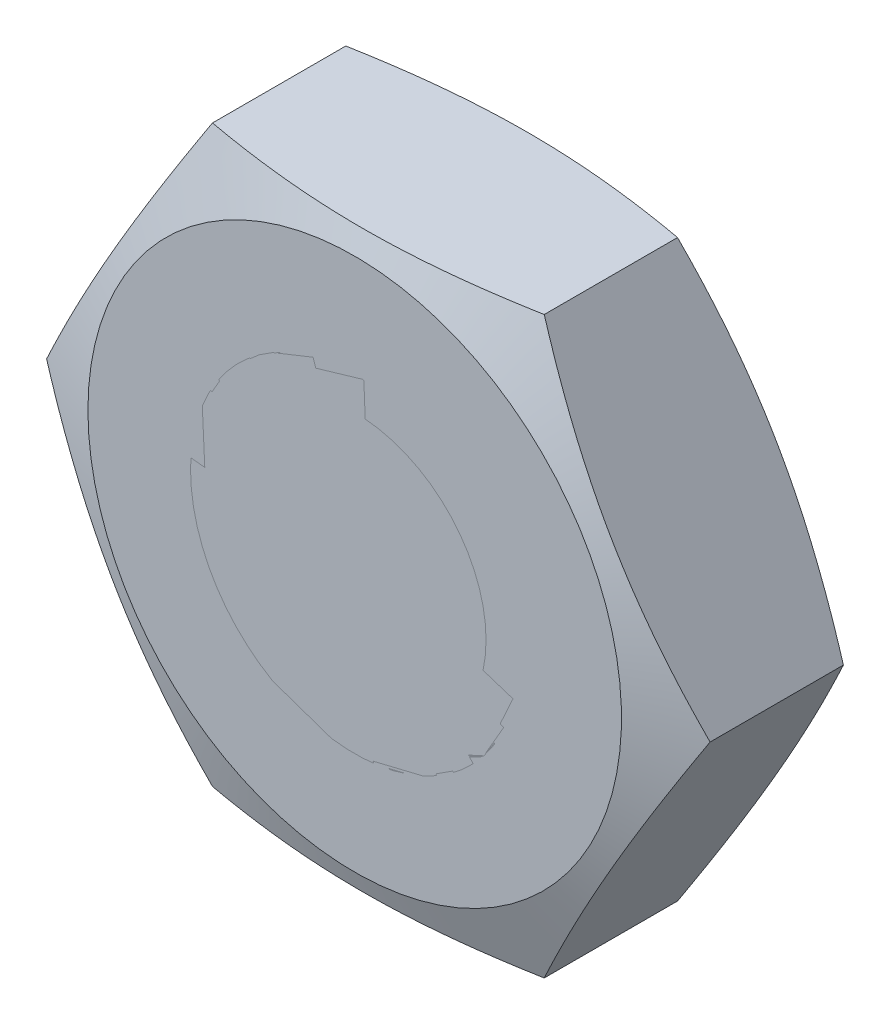
ISO-10303-21;
HEADER;
FILE_DESCRIPTION(('STEP AP214'),'2;1');
FILE_NAME('part.step','',(''),(''),'','','');
FILE_SCHEMA(('AUTOMOTIVE_DESIGN { 1 0 10303 214 1 1 1 1 }'));
ENDSEC;
DATA;
#1=APPLICATION_CONTEXT('core data for automotive mechanical design processes');
#2=APPLICATION_PROTOCOL_DEFINITION('international standard','automotive_design',2000,#1);
#3=PRODUCT_CONTEXT('',#1,'mechanical');
#4=PRODUCT('Part','Part','',(#3));
#5=PRODUCT_RELATED_PRODUCT_CATEGORY('part','',(#4));
#6=PRODUCT_DEFINITION_FORMATION('','',#4);
#7=PRODUCT_DEFINITION_CONTEXT('part definition',#1,'design');
#8=PRODUCT_DEFINITION('design','',#6,#7);
#9=PRODUCT_DEFINITION_SHAPE('','',#8);
#10=(LENGTH_UNIT() NAMED_UNIT(*) SI_UNIT(.MILLI.,.METRE.));
#11=(NAMED_UNIT(*) PLANE_ANGLE_UNIT() SI_UNIT($,.RADIAN.));
#12=(NAMED_UNIT(*) SI_UNIT($,.STERADIAN.) SOLID_ANGLE_UNIT());
#13=UNCERTAINTY_MEASURE_WITH_UNIT(LENGTH_MEASURE(1.E-05),#10,'distance_accuracy_value','');
#14=(GEOMETRIC_REPRESENTATION_CONTEXT(3) GLOBAL_UNCERTAINTY_ASSIGNED_CONTEXT((#13)) GLOBAL_UNIT_ASSIGNED_CONTEXT((#10,
#11,#12)) REPRESENTATION_CONTEXT('',''));
#15=CARTESIAN_POINT('',(0.,0.,0.));
#16=DIRECTION('',(0.,0.,1.));
#17=DIRECTION('',(1.,0.,0.));
#18=AXIS2_PLACEMENT_3D('',#15,#16,#17);
#19=CARTESIAN_POINT('',(2.020725942164,-3.5,2.2));
#20=DIRECTION('',(0.,0.,1.));
#21=DIRECTION('',(1.,0.,0.));
#22=AXIS2_PLACEMENT_3D('',#19,#20,#21);
#23=PLANE('',#22);
#24=CARTESIAN_POINT('',(2.020725942164,-3.5,2.2));
#25=DIRECTION('',(0.,0.,1.));
#26=DIRECTION('',(1.,0.,0.));
#27=AXIS2_PLACEMENT_3D('',#24,#25,#26);
#28=CIRCLE('',#27,2.);
#29=CARTESIAN_POINT('',(4.020725942164,-3.5,2.2));
#30=VERTEX_POINT('',#29);
#31=EDGE_CURVE('P0_E18',#30,#30,#28,.F.);
#32=ORIENTED_EDGE('',*,*,#31,.F.);
#33=EDGE_LOOP('',(#32));
#34=FACE_BOUND('',#33,.T.);
#35=ADVANCED_FACE('P0_F15',(#34),#23,.T.);
#36=CARTESIAN_POINT('',(2.020725942164,-3.5,0.));
#37=DIRECTION('',(0.,0.,1.));
#38=DIRECTION('',(1.,0.,0.));
#39=AXIS2_PLACEMENT_3D('',#36,#37,#38);
#40=PLANE('',#39);
#41=CARTESIAN_POINT('',(2.020725942164,-3.5,0.));
#42=DIRECTION('',(0.,0.,1.));
#43=DIRECTION('',(1.,0.,0.));
#44=AXIS2_PLACEMENT_3D('',#41,#42,#43);
#45=CIRCLE('',#44,2.);
#46=CARTESIAN_POINT('',(4.020725942164,-3.5,0.));
#47=VERTEX_POINT('',#46);
#48=EDGE_CURVE('P0_E10',#47,#47,#45,.T.);
#49=ORIENTED_EDGE('',*,*,#48,.F.);
#50=EDGE_LOOP('',(#49));
#51=FACE_BOUND('',#50,.T.);
#52=ADVANCED_FACE('P0_F30',(#51),#40,.F.);
#53=CARTESIAN_POINT('',(2.020725942164,-3.5,-0.11));
#54=DIRECTION('',(0.,0.,1.));
#55=DIRECTION('',(1.,0.,0.));
#56=AXIS2_PLACEMENT_3D('',#53,#54,#55);
#57=CYLINDRICAL_SURFACE('',#56,2.);
#58=ORIENTED_EDGE('',*,*,#48,.T.);
#59=EDGE_LOOP('',(#58));
#60=FACE_BOUND('',#59,.T.);
#61=ORIENTED_EDGE('',*,*,#31,.T.);
#62=EDGE_LOOP('',(#61));
#63=FACE_BOUND('',#62,.T.);
#64=ADVANCED_FACE('P0_F27',(#60,#63),#57,.T.);
#65=CLOSED_SHELL('',(#35,#52,#64));
#66=MANIFOLD_SOLID_BREP('P0_B1',#65);
#67=CARTESIAN_POINT('',(2.020725942164,-3.5,1.91020668273723));
#68=DIRECTION('',(0.,0.,-1.));
#69=DIRECTION('',(-1.,0.,0.));
#70=AXIS2_PLACEMENT_3D('',#67,#68,#69);
#71=CONICAL_SURFACE('',#70,4.04620059547785,1.22173047639522);
#72=CARTESIAN_POINT('',(-2.02072594215992,-3.49999999999331,1.91193507224839));
#73=CARTESIAN_POINT('',(-1.93704322560192,-3.35505728319948,1.94240310773807));
#74=CARTESIAN_POINT('',(-1.85308457675273,-3.20963663765786,1.97011895536221));
#75=CARTESIAN_POINT('',(-1.68462142300532,-2.91784989616407,2.01888057392236));
#76=CARTESIAN_POINT('',(-1.60011654349419,-2.77148315136331,2.03992112653968));
#77=CARTESIAN_POINT('',(-1.43149864661493,-2.47942838690303,2.07395357182836));
#78=CARTESIAN_POINT('',(-1.34738947929489,-2.33374703572242,2.08701968754836));
#79=CARTESIAN_POINT('',(-1.17897447460527,-2.04204369084306,2.1045450090109));
#80=CARTESIAN_POINT('',(-1.09466872284268,-1.89602184541998,2.10900744143009));
#81=CARTESIAN_POINT('',(-0.926057219317514,-1.60397815457382,2.10900744142997));
#82=CARTESIAN_POINT('',(-0.84175146755493,-1.45795630915074,2.10454500901067));
#83=CARTESIAN_POINT('',(-0.673336462865315,-1.16625296427139,2.0870196875479));
#84=CARTESIAN_POINT('',(-0.589227295545286,-1.02057161309079,2.07395357182779));
#85=CARTESIAN_POINT('',(-0.420609398666032,-0.728516848630528,2.0399211265389));
#86=CARTESIAN_POINT('',(-0.336104519154911,-0.582150103829787,2.01888057392149));
#87=CARTESIAN_POINT('',(-0.167641365407513,-0.290363362336019,1.97011895536117));
#88=CARTESIAN_POINT('',(-0.083682716558335,-0.144942716794415,1.94240310773695));
#89=CARTESIAN_POINT('',(-3.45626656504142E-13,-5.98642929515307E-13,1.9119350722472));
#90=B_SPLINE_CURVE_WITH_KNOTS('',3,(#72,#73,#74,#75,#76,#77,#78,#79,#80,#81,#82,#83,#84,#85,#86,
#87,#88,#89),.UNSPECIFIED.,.F.,.F.,(4,2,2,2,2,2,2,2,4),(0.,0.510400948318125,1.02119991787965,
1.52716902068894,2.03294833077303,2.53872764085711,3.0446967436664,3.55549571322791,
4.06589666154603),.UNSPECIFIED.);
#91=CARTESIAN_POINT('',(-2.02072594213581,-3.50000000000002,1.91193507225762));
#92=VERTEX_POINT('',#91);
#93=CARTESIAN_POINT('',(-1.72978104038741E-13,-2.9960686479202E-13,1.91193507224713));
#94=VERTEX_POINT('',#93);
#95=EDGE_CURVE('P1_E95',#92,#94,#90,.T.);
#96=ORIENTED_EDGE('',*,*,#95,.F.);
#97=CARTESIAN_POINT('',(-5.15205759565286E-13,-6.99999999999949,1.91193507224714));
#98=CARTESIAN_POINT('',(-0.0836827165585028,-6.85505728320567,1.94240310773689));
#99=CARTESIAN_POINT('',(-0.167641365407679,-6.70963663766407,1.97011895536111));
#100=CARTESIAN_POINT('',(-0.336104519155074,-6.41784989617031,2.01888057392142));
#101=CARTESIAN_POINT('',(-0.420609398666194,-6.27148315136957,2.03992112653884));
#102=CARTESIAN_POINT('',(-0.589227295545445,-5.97942838690931,2.07395357182772));
#103=CARTESIAN_POINT('',(-0.673336462865472,-5.83374703572872,2.08701968754783));
#104=CARTESIAN_POINT('',(-0.841751467555085,-5.54204369084937,2.1045450090106));
#105=CARTESIAN_POINT('',(-0.926057219317666,-5.3960218454263,2.1090074414299));
#106=CARTESIAN_POINT('',(-1.09466872284283,-5.10397815458015,2.10900744143002));
#107=CARTESIAN_POINT('',(-1.17897447460542,-4.95795630915707,2.10454500901083));
#108=CARTESIAN_POINT('',(-1.34738947929504,-4.66625296427771,2.08701968754829));
#109=CARTESIAN_POINT('',(-1.43149864661507,-4.5205716130971,2.07395357182829));
#110=CARTESIAN_POINT('',(-1.60011654349433,-4.22851684863682,2.03992112653962));
#111=CARTESIAN_POINT('',(-1.68462142300546,-4.08215010383607,2.0188805739223));
#112=CARTESIAN_POINT('',(-1.85308457675287,-3.79036336234228,1.97011895536216));
#113=CARTESIAN_POINT('',(-1.93704322560205,-3.64494271680067,1.94240310773802));
#114=CARTESIAN_POINT('',(-2.02072594216005,-3.50000000000684,1.91193507224834));
#115=B_SPLINE_CURVE_WITH_KNOTS('',3,(#97,#98,#99,#100,#101,#102,#103,#104,#105,#106,#107,#108,
#109,#110,#111,#112,#113,#114),.UNSPECIFIED.,.F.,.F.,(4,2,2,2,2,2,2,2,4),(0.,0.510400948318107,
1.02119991787961,1.52716902068889,2.03294833077296,2.53872764085705,3.04469674366633,
3.55549571322784,4.06589666154595),.UNSPECIFIED.);
#116=CARTESIAN_POINT('',(2.16593128271901E-13,-7.00000000000005,1.9119350722471));
#117=VERTEX_POINT('',#116);
#118=EDGE_CURVE('P1_E99',#117,#92,#115,.T.);
#119=ORIENTED_EDGE('',*,*,#118,.F.);
#120=CARTESIAN_POINT('',(4.04145188432634,-7.,1.91193507224737));
#121=CARTESIAN_POINT('',(3.87408645121008,-7.,1.94240310773718));
#122=CARTESIAN_POINT('',(3.70616915351144,-7.,1.97011895536143));
#123=CARTESIAN_POINT('',(3.36924284601608,-7.,2.0188805739218));
#124=CARTESIAN_POINT('',(3.20023308699355,-7.,2.03992112653923));
#125=CARTESIAN_POINT('',(2.86299729323448,-7.,2.07395357182811));
#126=CARTESIAN_POINT('',(2.69477895859414,-7.,2.0870196875482));
#127=CARTESIAN_POINT('',(2.35794894921435,-7.,2.1045450090109));
#128=CARTESIAN_POINT('',(2.1893374456889,-7.,2.10900744143015));
#129=CARTESIAN_POINT('',(1.85211443863801,-7.,2.10900744143013));
#130=CARTESIAN_POINT('',(1.68350293511257,-7.,2.10454500901086));
#131=CARTESIAN_POINT('',(1.34667292573278,-7.,2.08701968754813));
#132=CARTESIAN_POINT('',(1.17845459109244,-7.,2.07395357182802));
#133=CARTESIAN_POINT('',(0.841218797333374,-7.,2.03992112653911));
#134=CARTESIAN_POINT('',(0.672209038310848,-7.,2.01888057392166));
#135=CARTESIAN_POINT('',(0.335282730815489,-7.,1.97011895536126));
#136=CARTESIAN_POINT('',(0.167365433116854,-7.,1.94240310773699));
#137=CARTESIAN_POINT('',(5.97622679239069E-13,-7.,1.91193507224718));
#138=B_SPLINE_CURVE_WITH_KNOTS('',3,(#120,#121,#122,#123,#124,#125,#126,#127,#128,#129,#130,
#131,#132,#133,#134,#135,#136,#137),.UNSPECIFIED.,.F.,.F.,(4,2,2,2,2,2,2,2,4),(0.,
0.510400948318987,1.02119991788138,1.52716902069151,2.03294833077644,2.53872764086137,
3.0446967436715,3.55549571323389,4.06589666155288),.UNSPECIFIED.);
#139=CARTESIAN_POINT('',(4.04145188432716,-6.99999999999971,1.91193507224731));
#140=VERTEX_POINT('',#139);
#141=EDGE_CURVE('P1_E73',#140,#117,#138,.T.);
#142=ORIENTED_EDGE('',*,*,#141,.F.);
#143=CARTESIAN_POINT('',(6.06217782648779,-3.50000000000518,1.91193507224843));
#144=CARTESIAN_POINT('',(5.97849510992976,-3.64494271679907,1.94240310773815));
#145=CARTESIAN_POINT('',(5.89453646108053,-3.79036336234075,1.97011895536232));
#146=CARTESIAN_POINT('',(5.72607330733305,-4.08215010383467,2.01888057392253));
#147=CARTESIAN_POINT('',(5.64156842782188,-4.22851684863549,2.03992112653987));
#148=CARTESIAN_POINT('',(5.47295053094254,-4.52057161309591,2.0739535718286));
#149=CARTESIAN_POINT('',(5.38884136362247,-4.66625296427657,2.08701968754863));
#150=CARTESIAN_POINT('',(5.22042635893277,-4.95795630915607,2.1045450090112));
#151=CARTESIAN_POINT('',(5.13612060717015,-5.10397815457921,2.10900744143039));
#152=CARTESIAN_POINT('',(4.96750910364491,-5.3960218454255,2.10900744143029));
#153=CARTESIAN_POINT('',(4.88320335188229,-5.54204369084864,2.10454500901099));
#154=CARTESIAN_POINT('',(4.7147883471926,-5.83374703572812,2.08701968754822));
#155=CARTESIAN_POINT('',(4.63067917987253,-5.97942838690878,2.0739535718281));
#156=CARTESIAN_POINT('',(4.4620612829932,-6.27148315136918,2.03992112653919));
#157=CARTESIAN_POINT('',(4.37755640348204,-6.41784989616998,2.01888057392175));
#158=CARTESIAN_POINT('',(4.20909324973457,-6.70963663766388,1.97011895536139));
#159=CARTESIAN_POINT('',(4.12513460088535,-6.85505728320555,1.94240310773715));
#160=CARTESIAN_POINT('',(4.04145188432733,-6.99999999999943,1.91193507224737));
#161=B_SPLINE_CURVE_WITH_KNOTS('',3,(#143,#144,#145,#146,#147,#148,#149,#150,#151,#152,#153,
#154,#155,#156,#157,#158,#159,#160),.UNSPECIFIED.,.F.,.F.,(4,2,2,2,2,2,2,2,4),(0.,
0.510400948318355,1.02119991788011,1.52716902068962,2.03294833077393,2.53872764085824,
3.04469674366775,3.5554957132295,4.06589666154785),.UNSPECIFIED.);
#162=CARTESIAN_POINT('',(6.0621778264931,-3.5,1.91193507225762));
#163=VERTEX_POINT('',#162);
#164=EDGE_CURVE('P1_E21',#163,#140,#161,.T.);
#165=ORIENTED_EDGE('',*,*,#164,.F.);
#166=CARTESIAN_POINT('',(4.0414518843275,-4.85621275236117E-13,1.91193507224732));
#167=CARTESIAN_POINT('',(4.12513460088552,-0.144942716794363,1.94240310773709));
#168=CARTESIAN_POINT('',(4.20909324973474,-0.290363362336028,1.97011895536133));
#169=CARTESIAN_POINT('',(4.37755640348221,-0.58215010382992,2.01888057392169));
#170=CARTESIAN_POINT('',(4.46206128299337,-0.728516848630725,2.03992112653912));
#171=CARTESIAN_POINT('',(4.63067917987269,-1.02057161309111,2.07395357182803));
#172=CARTESIAN_POINT('',(4.71478834719275,-1.16625296427177,2.08701968754815));
#173=CARTESIAN_POINT('',(4.88320335188244,-1.45795630915125,2.10454500901092));
#174=CARTESIAN_POINT('',(4.96750910364506,-1.60397815457438,2.10900744143022));
#175=CARTESIAN_POINT('',(5.1361206071703,-1.89602184542067,2.10900744143033));
#176=CARTESIAN_POINT('',(5.22042635893292,-2.04204369084381,2.10454500901113));
#177=CARTESIAN_POINT('',(5.38884136362262,-2.3337470357233,2.08701968754856));
#178=CARTESIAN_POINT('',(5.47295053094269,-2.47942838690396,2.07395357182854));
#179=CARTESIAN_POINT('',(5.64156842782202,-2.77148315136437,2.03992112653981));
#180=CARTESIAN_POINT('',(5.72607330733319,-2.91784989616519,2.01888057392247));
#181=CARTESIAN_POINT('',(5.89453646108067,-3.2096366376591,1.97011895536227));
#182=CARTESIAN_POINT('',(5.97849510992989,-3.35505728320078,1.9424031077381));
#183=CARTESIAN_POINT('',(6.06217782648792,-3.49999999999467,1.91193507224839));
#184=B_SPLINE_CURVE_WITH_KNOTS('',3,(#166,#167,#168,#169,#170,#171,#172,#173,#174,#175,#176,
#177,#178,#179,#180,#181,#182,#183),.UNSPECIFIED.,.F.,.F.,(4,2,2,2,2,2,2,2,4),(0.,
0.510400948318338,1.02119991788008,1.52716902068957,2.03294833077387,2.53872764085818,
3.04469674366768,3.55549571322942,4.06589666154777),.UNSPECIFIED.);
#185=CARTESIAN_POINT('',(4.0414518843268,0.,1.91193507224727));
#186=VERTEX_POINT('',#185);
#187=EDGE_CURVE('P1_E71',#186,#163,#184,.T.);
#188=ORIENTED_EDGE('',*,*,#187,.F.);
#189=CARTESIAN_POINT('',(6.92005667780515E-13,0.,1.9119350722472));
#190=CARTESIAN_POINT('',(0.167365433116948,0.,1.94240310773701));
#191=CARTESIAN_POINT('',(0.335282730815583,0.,1.97011895536128));
#192=CARTESIAN_POINT('',(0.672209038310944,0.,2.01888057392168));
#193=CARTESIAN_POINT('',(0.84121879733347,0.,2.03992112653912));
#194=CARTESIAN_POINT('',(1.17845459109254,0.,2.07395357182803));
#195=CARTESIAN_POINT('',(1.34667292573288,0.,2.08701968754814));
#196=CARTESIAN_POINT('',(1.68350293511266,0.,2.10454500901086));
#197=CARTESIAN_POINT('',(1.85211443863811,0.,2.10900744143013));
#198=CARTESIAN_POINT('',(2.189337445689,0.,2.10900744143015));
#199=CARTESIAN_POINT('',(2.35794894921444,0.,2.10454500901089));
#200=CARTESIAN_POINT('',(2.69477895859423,0.,2.0870196875482));
#201=CARTESIAN_POINT('',(2.86299729323457,0.,2.0739535718281));
#202=CARTESIAN_POINT('',(3.20023308699365,0.,2.03992112653922));
#203=CARTESIAN_POINT('',(3.36924284601617,0.,2.01888057392179));
#204=CARTESIAN_POINT('',(3.70616915351154,0.,1.97011895536142));
#205=CARTESIAN_POINT('',(3.87408645121018,0.,1.94240310773716));
#206=CARTESIAN_POINT('',(4.04145188432643,0.,1.91193507224736));
#207=B_SPLINE_CURVE_WITH_KNOTS('',3,(#189,#190,#191,#192,#193,#194,#195,#196,#197,#198,#199,
#200,#201,#202,#203,#204,#205,#206),.UNSPECIFIED.,.F.,.F.,(4,2,2,2,2,2,2,2,4),(0.,
0.510400948318986,1.02119991788137,1.5271690206915,2.03294833077644,2.53872764086137,
3.0446967436715,3.55549571323389,4.06589666155288),.UNSPECIFIED.);
#208=EDGE_CURVE('P1_E87',#94,#186,#207,.T.);
#209=ORIENTED_EDGE('',*,*,#208,.F.);
#210=EDGE_LOOP('',(#96,#119,#142,#165,#188,#209));
#211=FACE_BOUND('',#210,.T.);
#212=CARTESIAN_POINT('',(2.020725942164,-3.5,2.2000000000042));
#213=DIRECTION('',(0.,0.,-1.));
#214=DIRECTION('',(-1.,0.,0.));
#215=AXIS2_PLACEMENT_3D('',#212,#213,#214);
#216=CIRCLE('',#215,3.24999999997999);
#217=CARTESIAN_POINT('',(-1.22927405781599,-3.5,2.2000000000042));
#218=VERTEX_POINT('',#217);
#219=EDGE_CURVE('P1_E82',#218,#218,#216,.F.);
#220=ORIENTED_EDGE('',*,*,#219,.F.);
#221=EDGE_LOOP('',(#220));
#222=FACE_BOUND('',#221,.T.);
#223=ADVANCED_FACE('P1_F17',(#211,#222),#71,.T.);
#224=CARTESIAN_POINT('',(4.041451884327,-7.,0.));
#225=DIRECTION('',(0.866025403784429,-0.500000000000017,0.));
#226=DIRECTION('',(0.500000000000017,0.866025403784429,0.));
#227=AXIS2_PLACEMENT_3D('',#224,#225,#226);
#228=PLANE('',#227);
#229=DIRECTION('',(0.,0.,1.));
#230=VECTOR('',#229,1.);
#231=CARTESIAN_POINT('',(6.062177826491,-3.5,0.));
#232=LINE('',#231,#230);
#233=CARTESIAN_POINT('',(6.06217782643468,-3.5,0.288064927715068));
#234=VERTEX_POINT('',#233);
#235=EDGE_CURVE('P1_E39',#163,#234,#232,.F.);
#236=ORIENTED_EDGE('',*,*,#235,.F.);
#237=ORIENTED_EDGE('',*,*,#164,.T.);
#238=DIRECTION('',(0.,0.,-1.));
#239=VECTOR('',#238,1.);
#240=CARTESIAN_POINT('',(4.041451884327,-7.,0.));
#241=LINE('',#240,#239);
#242=CARTESIAN_POINT('',(4.0414519078291,-6.99999995929317,0.288064919214225));
#243=VERTEX_POINT('',#242);
#244=EDGE_CURVE('P1_E77',#243,#140,#241,.F.);
#245=ORIENTED_EDGE('',*,*,#244,.F.);
#246=CARTESIAN_POINT('',(6.06217782646331,-3.50000000001825,0.288064927773809));
#247=CARTESIAN_POINT('',(5.97849511190109,-3.64494271337409,0.257596893001288));
#248=CARTESIAN_POINT('',(5.89453646505706,-3.79036335545038,0.229881045965925));
#249=CARTESIAN_POINT('',(5.72607331534163,-4.08215008996623,0.181119428242438));
#250=CARTESIAN_POINT('',(5.64156843785735,-4.22851683125431,0.160078875872477));
#251=CARTESIAN_POINT('',(5.47295054499647,-4.52057158875303,0.126046430643023));
#252=CARTESIAN_POINT('',(5.38884137966769,-4.66625293648523,0.112980314741789));
#253=CARTESIAN_POINT('',(5.22042637895351,-4.95795627447933,0.095454992466907));
#254=CARTESIAN_POINT('',(5.13612062917512,-5.10397811646555,0.0909925594169994));
#255=CARTESIAN_POINT('',(4.96750912957955,-5.39602180050533,0.0909925577357796));
#256=CARTESIAN_POINT('',(4.88320337976239,-5.54204364255888,0.0954549891061684));
#257=CARTESIAN_POINT('',(4.71478837893205,-5.8337469807538,0.112980308143858));
#258=CARTESIAN_POINT('',(4.63067921352586,-5.97942832861952,0.126046422487378));
#259=CARTESIAN_POINT('',(4.46206132048868,-6.27148308642509,0.160078864792022));
#260=CARTESIAN_POINT('',(4.37755644290529,-6.41784982788692,0.181119415796669));
#261=CARTESIAN_POINT('',(4.20909329297385,-6.70963656277126,0.229881031014337));
#262=CARTESIAN_POINT('',(4.12513464601297,-6.85505720504223,0.257596876909348));
#263=CARTESIAN_POINT('',(4.04145193133173,-6.99999991858543,0.288064910659968));
#264=B_SPLINE_CURVE_WITH_KNOTS('',3,(#246,#247,#248,#249,#250,#251,#252,#253,#254,#255,#256,
#257,#258,#259,#260,#261,#262,#263),.UNSPECIFIED.,.F.,.F.,(4,2,2,2,2,2,2,2,4),(0.,
0.510400936193732,1.02119989360191,1.52716898456034,2.032948282811,2.53872758115806,
3.04469667220784,3.55549562969648,4.06589656599562),.UNSPECIFIED.);
#265=EDGE_CURVE('P1_E86',#234,#243,#264,.T.);
#266=ORIENTED_EDGE('',*,*,#265,.F.);
#267=EDGE_LOOP('',(#236,#237,#245,#266));
#268=FACE_BOUND('',#267,.T.);
#269=ADVANCED_FACE('P1_F85',(#268),#228,.T.);
#270=CARTESIAN_POINT('',(0.,-7.,0.));
#271=DIRECTION('',(0.,-1.,0.));
#272=DIRECTION('',(0.,0.,-1.));
#273=AXIS2_PLACEMENT_3D('',#270,#271,#272);
#274=PLANE('',#273);
#275=ORIENTED_EDGE('',*,*,#244,.T.);
#276=ORIENTED_EDGE('',*,*,#141,.T.);
#277=DIRECTION('',(0.,0.,1.));
#278=VECTOR('',#277,1.);
#279=CARTESIAN_POINT('',(-1.63931368479808E-13,-7.0000000000001,0.));
#280=LINE('',#279,#278);
#281=CARTESIAN_POINT('',(4.69805930120417E-08,-7.00000000000005,0.288064919218717));
#282=VERTEX_POINT('',#281);
#283=EDGE_CURVE('P1_E100',#282,#117,#280,.T.);
#284=ORIENTED_EDGE('',*,*,#283,.F.);
#285=CARTESIAN_POINT('',(4.0414519214205,-6.99999995929526,0.288064965005394));
#286=CARTESIAN_POINT('',(3.87408649325916,-6.99999998538238,0.25759691040732));
#287=CARTESIAN_POINT('',(3.70616919869671,-6.99999999608305,0.229881054752203));
#288=CARTESIAN_POINT('',(3.36924289605888,-7.00000000392001,0.18111942976949));
#289=CARTESIAN_POINT('',(3.20023313875752,-7.00000000104572,0.160078878760528));
#290=CARTESIAN_POINT('',(2.86299734907461,-6.99999999896417,0.12604643375047));
#291=CARTESIAN_POINT('',(2.6947790167863,-6.99999999972249,0.112980316718249));
#292=CARTESIAN_POINT('',(2.35794901187284,-7.00000000027741,0.0954549930266526));
#293=CARTESIAN_POINT('',(2.18933751046151,-7.00000000007436,0.0909925596948046));
#294=CARTESIAN_POINT('',(1.85211450794729,-6.99999999992564,0.090992557458381));
#295=CARTESIAN_POINT('',(1.6835030068444,-6.99999999997997,0.0954549885357476));
#296=CARTESIAN_POINT('',(1.34667300229186,-7.00000000002004,0.112980307202581));
#297=CARTESIAN_POINT('',(1.17845467005602,-7.00000000000575,0.1260464214654));
#298=CARTESIAN_POINT('',(0.841218880874048,-6.9999999999942,0.160078863773387));
#299=CARTESIAN_POINT('',(0.672209124024438,-6.9999999999971,0.181119414875411));
#300=CARTESIAN_POINT('',(0.335282820730156,-7.0000000000029,0.229881030444503));
#301=CARTESIAN_POINT('',(0.167365525060284,-7.00000000000579,0.257596876596819));
#302=CARTESIAN_POINT('',(9.39613496518751E-08,-7.,0.288064910668904));
#303=B_SPLINE_CURVE_WITH_KNOTS('',3,(#285,#286,#287,#288,#289,#290,#291,#292,#293,#294,#295,
#296,#297,#298,#299,#300,#301,#302),.UNSPECIFIED.,.F.,.F.,(4,2,2,2,2,2,2,2,4),(0.,
0.510400942943331,1.02119990655005,1.52716900278542,2.03294830655257,2.53872760929638,
3.04469670457124,3.55549566710267,4.06589660869785),.UNSPECIFIED.);
#304=EDGE_CURVE('P1_E170',#243,#282,#303,.T.);
#305=ORIENTED_EDGE('',*,*,#304,.F.);
#306=EDGE_LOOP('',(#275,#276,#284,#305));
#307=FACE_BOUND('',#306,.T.);
#308=ADVANCED_FACE('P1_F178',(#307),#274,.T.);
#309=CARTESIAN_POINT('',(-2.020725942164,-3.5,0.));
#310=DIRECTION('',(-0.866025403784429,-0.500000000000017,0.));
#311=DIRECTION('',(0.500000000000017,-0.866025403784429,0.));
#312=AXIS2_PLACEMENT_3D('',#309,#310,#311);
#313=PLANE('',#312);
#314=ORIENTED_EDGE('',*,*,#283,.T.);
#315=ORIENTED_EDGE('',*,*,#118,.T.);
#316=DIRECTION('',(0.,0.,1.));
#317=VECTOR('',#316,1.);
#318=CARTESIAN_POINT('',(-2.02072594216384,-3.5000000000001,0.));
#319=LINE('',#318,#317);
#320=CARTESIAN_POINT('',(-2.02072594215463,-3.50000000000005,0.288064927749363));
#321=VERTEX_POINT('',#320);
#322=EDGE_CURVE('P1_E96',#321,#92,#319,.T.);
#323=ORIENTED_EDGE('',*,*,#322,.F.);
#324=CARTESIAN_POINT('',(5.37776872294602E-08,-7.00000001178815,0.288064964987089));
#325=CARTESIAN_POINT('',(-0.0836826848666435,-6.85505730888085,0.257596909676681));
#326=CARTESIAN_POINT('',(-0.167641343408856,-6.7096366679382,0.229881053434555));
#327=CARTESIAN_POINT('',(-0.336104505535809,-6.41784992759462,0.181119427615967));
#328=CARTESIAN_POINT('',(-0.42060938372441,-6.27148317933962,0.160078876358664));
#329=CARTESIAN_POINT('',(-0.589227280779085,-5.97942841041505,0.126046431288083));
#330=CARTESIAN_POINT('',(-0.673336449568467,-5.83374705820514,0.11298031443677));
#331=CARTESIAN_POINT('',(-0.841751456476531,-5.54204371059245,0.0954549915566093));
#332=CARTESIAN_POINT('',(-0.926057208988603,-5.39602186346538,0.0909925588548991));
#333=CARTESIAN_POINT('',(-1.09466871404252,-5.10397816967411,0.0909925582986478));
#334=CARTESIAN_POINT('',(-1.17897446658436,-4.95795632300991,0.0954549904243546));
#335=CARTESIAN_POINT('',(-1.34738947275054,-4.66625297565316,0.112980311515123));
#336=CARTESIAN_POINT('',(-1.43149864076793,-4.52057162323614,0.126046427153969));
#337=CARTESIAN_POINT('',(-1.60011653918696,-4.22851685608581,0.160078872445142));
#338=CARTESIAN_POINT('',(-1.68462141953998,-4.08215010983266,0.181119425159449));
#339=CARTESIAN_POINT('',(-1.85308457500403,-3.79036336537716,0.229881044070335));
#340=CARTESIAN_POINT('',(-1.93704322472772,-3.64494271832664,0.257596891951484));
#341=CARTESIAN_POINT('',(-2.02072594214686,-3.50000000002969,0.288064927762402));
#342=B_SPLINE_CURVE_WITH_KNOTS('',3,(#324,#325,#326,#327,#328,#329,#330,#331,#332,#333,#334,
#335,#336,#337,#338,#339,#340,#341),.UNSPECIFIED.,.F.,.F.,(4,2,2,2,2,2,2,2,4),(0.,
0.510400955054922,1.02119993080235,1.52716903887604,2.03294835446403,2.53872766893264,
3.04469677595482,3.55549575054686,4.0658967041487),.UNSPECIFIED.);
#343=EDGE_CURVE('P1_E164',#282,#321,#342,.T.);
#344=ORIENTED_EDGE('',*,*,#343,.F.);
#345=EDGE_LOOP('',(#314,#315,#323,#344));
#346=FACE_BOUND('',#345,.T.);
#347=ADVANCED_FACE('P1_F153',(#346),#313,.T.);
#348=CARTESIAN_POINT('',(0.,0.,0.));
#349=DIRECTION('',(-0.866025403784429,0.500000000000017,0.));
#350=DIRECTION('',(-0.500000000000017,-0.866025403784429,0.));
#351=AXIS2_PLACEMENT_3D('',#348,#349,#350);
#352=PLANE('',#351);
#353=ORIENTED_EDGE('',*,*,#322,.T.);
#354=ORIENTED_EDGE('',*,*,#95,.T.);
#355=DIRECTION('',(0.,0.,1.));
#356=VECTOR('',#355,1.);
#357=CARTESIAN_POINT('',(0.,0.,0.));
#358=LINE('',#357,#356);
#359=CARTESIAN_POINT('',(-2.34943352812816E-08,-4.0693382397236E-08,0.288064919217232));
#360=VERTEX_POINT('',#359);
#361=EDGE_CURVE('P1_E90',#360,#94,#358,.T.);
#362=ORIENTED_EDGE('',*,*,#361,.F.);
#363=CARTESIAN_POINT('',(-2.02072594213337,-3.49999999998094,0.288064927775374));
#364=CARTESIAN_POINT('',(-1.93704322757184,-3.35505728662356,0.257596893001671));
#365=CARTESIAN_POINT('',(-1.85308458072776,-3.20963664454604,0.229881045965752));
#366=CARTESIAN_POINT('',(-1.68462143101154,-2.91784991002801,0.181119428241773));
#367=CARTESIAN_POINT('',(-1.60011655352654,-2.77148316873899,0.160078875871877));
#368=CARTESIAN_POINT('',(-1.43149866066442,-2.47942841123832,0.126046430642539));
#369=CARTESIAN_POINT('',(-1.34738949533511,-2.33374706350513,0.112980314741356));
#370=CARTESIAN_POINT('',(-1.17897449461983,-2.04204372550907,0.0954549924667388));
#371=CARTESIAN_POINT('',(-1.09466874484086,-1.89602188352187,0.090992559417046));
#372=CARTESIAN_POINT('',(-0.926057245244181,-1.60397819948018,0.0909925577363629));
#373=CARTESIAN_POINT('',(-0.841751495426476,-1.45795635742569,0.0954549891070721));
#374=CARTESIAN_POINT('',(-0.673336494595068,-1.16625301922892,0.112980308145492));
#375=CARTESIAN_POINT('',(-0.589227329188347,-1.02057167136228,0.126046422489422));
#376=CARTESIAN_POINT('',(-0.420609436150102,-0.728516913554847,0.160078864794945));
#377=CARTESIAN_POINT('',(-0.336104558566167,-0.582150172092087,0.181119415800064));
#378=CARTESIAN_POINT('',(-0.167641408633656,-0.290363437205893,0.229881031018704));
#379=CARTESIAN_POINT('',(-0.0836827616722465,-0.144942794933997,0.257596876914215));
#380=CARTESIAN_POINT('',(-4.69904730396895E-08,-8.13898867764341E-08,0.288064910665337));
#381=B_SPLINE_CURVE_WITH_KNOTS('',3,(#363,#364,#365,#366,#367,#368,#369,#370,#371,#372,#373,
#374,#375,#376,#377,#378,#379,#380),.UNSPECIFIED.,.F.,.F.,(4,2,2,2,2,2,2,2,4),(0.,
0.510400936197232,1.02119989360889,1.52716898457067,2.03294828282469,2.53872758117502,
3.04469667222807,3.5554956297201,4.06589656602263),.UNSPECIFIED.);
#382=EDGE_CURVE('P1_E158',#321,#360,#381,.T.);
#383=ORIENTED_EDGE('',*,*,#382,.F.);
#384=EDGE_LOOP('',(#353,#354,#362,#383));
#385=FACE_BOUND('',#384,.T.);
#386=ADVANCED_FACE('P1_F150',(#385),#352,.T.);
#387=CARTESIAN_POINT('',(4.041451884327,0.,0.));
#388=DIRECTION('',(0.,1.,0.));
#389=DIRECTION('',(0.,0.,1.));
#390=AXIS2_PLACEMENT_3D('',#387,#388,#389);
#391=PLANE('',#390);
#392=ORIENTED_EDGE('',*,*,#361,.T.);
#393=ORIENTED_EDGE('',*,*,#208,.T.);
#394=DIRECTION('',(0.,0.,1.));
#395=VECTOR('',#394,1.);
#396=CARTESIAN_POINT('',(4.04145188432716,0.,0.));
#397=LINE('',#396,#395);
#398=CARTESIAN_POINT('',(4.04145183732397,0.,0.288064919214452));
#399=VERTEX_POINT('',#398);
#400=EDGE_CURVE('P1_E81',#399,#186,#397,.T.);
#401=ORIENTED_EDGE('',*,*,#400,.F.);
#402=CARTESIAN_POINT('',(-3.70634152318429E-08,-4.06954732478455E-08,0.288064964993162));
#403=CARTESIAN_POINT('',(0.167365391095334,-1.46142976424724E-08,0.257596910400346));
#404=CARTESIAN_POINT('',(0.335282685654753,-3.9160633239904E-09,0.229881054747868));
#405=CARTESIAN_POINT('',(0.672208988286149,3.91911714694854E-09,0.181119429767963));
#406=CARTESIAN_POINT('',(0.841218745584096,1.04548143518179E-09,0.16007887875917));
#407=CARTESIAN_POINT('',(1.1784545352604,-1.03559586956682E-09,0.126046433749747));
#408=CARTESIAN_POINT('',(1.3466728675455,-2.77446294330393E-10,0.112980316717996));
#409=CARTESIAN_POINT('',(1.68350287245249,2.77342222348173E-10,0.0954549930268474));
#410=CARTESIAN_POINT('',(1.85211437386055,7.43417263291459E-11,0.0909925596949779));
#411=CARTESIAN_POINT('',(2.18933737636836,-7.43417511967065E-11,0.0909925574582075));
#412=CARTESIAN_POINT('',(2.3579488774681,-2.00247332240209E-11,0.0954549885352539));
#413=CARTESIAN_POINT('',(2.69477888201437,2.00322474487301E-11,0.112980307201135));
#414=CARTESIAN_POINT('',(2.86299721424709,5.74646911661345E-12,0.126046421463322));
#415=CARTESIAN_POINT('',(3.20023300342275,-5.80132361916034E-12,0.160078863769799));
#416=CARTESIAN_POINT('',(3.36924276026915,-2.89953125261771E-12,0.181119414870939));
#417=CARTESIAN_POINT('',(3.70616906355706,2.89727190318621E-12,0.229881030438091));
#418=CARTESIAN_POINT('',(3.87408635922376,5.79228621484986E-12,0.257596876589352));
#419=CARTESIAN_POINT('',(4.04145179031955,0.,0.288064910660333));
#420=B_SPLINE_CURVE_WITH_KNOTS('',3,(#402,#403,#404,#405,#406,#407,#408,#409,#410,#411,#412,
#413,#414,#415,#416,#417,#418,#419),.UNSPECIFIED.,.F.,.F.,(4,2,2,2,2,2,2,2,4),(0.,
0.510400942933084,1.02119990652966,1.5271690027553,2.03294830651271,2.53872760924704,
3.04469670451244,3.55549566703401,4.06589660861931),.UNSPECIFIED.);
#421=EDGE_CURVE('P1_E116',#360,#399,#420,.T.);
#422=ORIENTED_EDGE('',*,*,#421,.F.);
#423=EDGE_LOOP('',(#392,#393,#401,#422));
#424=FACE_BOUND('',#423,.T.);
#425=ADVANCED_FACE('P1_F129',(#424),#391,.T.);
#426=CARTESIAN_POINT('',(6.062177826491,-3.5,0.));
#427=DIRECTION('',(0.866025403784429,0.500000000000017,0.));
#428=DIRECTION('',(-0.500000000000017,0.866025403784429,0.));
#429=AXIS2_PLACEMENT_3D('',#426,#427,#428);
#430=PLANE('',#429);
#431=ORIENTED_EDGE('',*,*,#400,.T.);
#432=ORIENTED_EDGE('',*,*,#187,.T.);
#433=ORIENTED_EDGE('',*,*,#235,.T.);
#434=CARTESIAN_POINT('',(4.0414518305306,1.17701694121277E-08,0.288064965004648));
#435=CARTESIAN_POINT('',(4.12513456918808,-0.144942691127608,0.257596909682475));
#436=CARTESIAN_POINT('',(4.20909322773576,-0.290363332066482,0.229881053435521));
#437=CARTESIAN_POINT('',(4.37755638986683,-0.582150072407484,0.181119427613431));
#438=CARTESIAN_POINT('',(4.46206126805406,-0.728516820663688,0.160078876357453));
#439=CARTESIAN_POINT('',(4.63067916510776,-1.02057158958914,0.126046431287911));
#440=CARTESIAN_POINT('',(4.71478833389751,-1.16625294179875,0.112980314436319));
#441=CARTESIAN_POINT('',(4.88320334080586,-1.45795628941124,0.0954549915560341));
#442=CARTESIAN_POINT('',(4.96750909331784,-1.6039781365384,0.0909925588544816));
#443=CARTESIAN_POINT('',(5.13612059837159,-1.89602183032957,0.0909925582984352));
#444=CARTESIAN_POINT('',(5.22042635091335,-2.04204367699357,0.0954549904241762));
#445=CARTESIAN_POINT('',(5.38884135707931,-2.33374702434989,0.112980311515018));
#446=CARTESIAN_POINT('',(5.47295052509657,-2.47942837676669,0.126046427153901));
#447=CARTESIAN_POINT('',(5.64156842351542,-2.77148314391672,0.160078872445128));
#448=CARTESIAN_POINT('',(5.72607330386838,-2.91784989016976,0.181119425159459));
#449=CARTESIAN_POINT('',(5.89453645933234,-3.20963663462511,0.229881044070386));
#450=CARTESIAN_POINT('',(5.978495109056,-3.35505728167557,0.257596891951555));
#451=CARTESIAN_POINT('',(6.06217782647511,-3.49999999997248,0.288064927762493));
#452=B_SPLINE_CURVE_WITH_KNOTS('',3,(#434,#435,#436,#437,#438,#439,#440,#441,#442,#443,#444,
#445,#446,#447,#448,#449,#450,#451),.UNSPECIFIED.,.F.,.F.,(4,2,2,2,2,2,2,2,4),(0.,
0.51040095505569,1.02119993080353,1.52716903887714,2.03294835446522,2.53872766893319,
3.04469677595461,3.55549575054632,4.06589670414799),.UNSPECIFIED.);
#453=EDGE_CURVE('P1_E109',#399,#234,#452,.T.);
#454=ORIENTED_EDGE('',*,*,#453,.F.);
#455=EDGE_LOOP('',(#431,#432,#433,#454));
#456=FACE_BOUND('',#455,.T.);
#457=ADVANCED_FACE('P1_F79',(#456),#430,.T.);
#458=CARTESIAN_POINT('',(0.,0.,2.2));
#459=DIRECTION('',(0.,0.,1.));
#460=DIRECTION('',(1.,0.,0.));
#461=AXIS2_PLACEMENT_3D('',#458,#459,#460);
#462=PLANE('',#461);
#463=CARTESIAN_POINT('',(2.020725942164,-3.5,2.2));
#464=DIRECTION('',(0.,0.,1.));
#465=DIRECTION('',(1.,0.,0.));
#466=AXIS2_PLACEMENT_3D('',#463,#464,#465);
#467=CIRCLE('',#466,1.6);
#468=CARTESIAN_POINT('',(3.620725942164,-3.5,2.2));
#469=VERTEX_POINT('',#468);
#470=EDGE_CURVE('P1_E106',#469,#469,#467,.F.);
#471=ORIENTED_EDGE('',*,*,#470,.T.);
#472=EDGE_LOOP('',(#471));
#473=FACE_BOUND('',#472,.T.);
#474=ORIENTED_EDGE('',*,*,#219,.T.);
#475=EDGE_LOOP('',(#474));
#476=FACE_BOUND('',#475,.T.);
#477=ADVANCED_FACE('P1_F128',(#473,#476),#462,.T.);
#478=CARTESIAN_POINT('',(2.020725942164,-3.5,0.289793317250542));
#479=DIRECTION('',(0.,0.,1.));
#480=DIRECTION('',(1.,0.,0.));
#481=AXIS2_PLACEMENT_3D('',#478,#479,#480);
#482=CONICAL_SURFACE('',#481,4.04620059540132,1.22173047638085);
#483=ORIENTED_EDGE('',*,*,#343,.T.);
#484=ORIENTED_EDGE('',*,*,#382,.T.);
#485=ORIENTED_EDGE('',*,*,#421,.T.);
#486=ORIENTED_EDGE('',*,*,#453,.T.);
#487=ORIENTED_EDGE('',*,*,#265,.T.);
#488=ORIENTED_EDGE('',*,*,#304,.T.);
#489=EDGE_LOOP('',(#483,#484,#485,#486,#487,#488));
#490=FACE_BOUND('',#489,.T.);
#491=CARTESIAN_POINT('',(2.020725942164,-3.5,-1.53869972319143E-12));
#492=DIRECTION('',(0.,0.,1.));
#493=DIRECTION('',(1.,0.,0.));
#494=AXIS2_PLACEMENT_3D('',#491,#492,#493);
#495=CIRCLE('',#494,3.24999999997999);
#496=CARTESIAN_POINT('',(5.27072594214399,-3.5,-1.53869972319143E-12));
#497=VERTEX_POINT('',#496);
#498=EDGE_CURVE('P1_E30',#497,#497,#495,.T.);
#499=ORIENTED_EDGE('',*,*,#498,.T.);
#500=EDGE_LOOP('',(#499));
#501=FACE_BOUND('',#500,.T.);
#502=ADVANCED_FACE('P1_F122',(#490,#501),#482,.T.);
#503=CARTESIAN_POINT('',(2.020725942164,-3.5,-0.22));
#504=DIRECTION('',(0.,0.,1.));
#505=DIRECTION('',(1.,0.,0.));
#506=AXIS2_PLACEMENT_3D('',#503,#504,#505);
#507=CYLINDRICAL_SURFACE('',#506,1.6);
#508=ORIENTED_EDGE('',*,*,#470,.F.);
#509=EDGE_LOOP('',(#508));
#510=FACE_BOUND('',#509,.T.);
#511=CARTESIAN_POINT('',(2.020725942164,-3.5,0.));
#512=DIRECTION('',(0.,0.,1.));
#513=DIRECTION('',(1.,0.,0.));
#514=AXIS2_PLACEMENT_3D('',#511,#512,#513);
#515=CIRCLE('',#514,1.6);
#516=CARTESIAN_POINT('',(3.620725942164,-3.5,0.));
#517=VERTEX_POINT('',#516);
#518=EDGE_CURVE('P1_E11',#517,#517,#515,.F.);
#519=ORIENTED_EDGE('',*,*,#518,.T.);
#520=EDGE_LOOP('',(#519));
#521=FACE_BOUND('',#520,.T.);
#522=ADVANCED_FACE('P1_F210',(#510,#521),#507,.F.);
#523=CARTESIAN_POINT('',(0.,0.,0.));
#524=DIRECTION('',(0.,0.,1.));
#525=DIRECTION('',(1.,0.,0.));
#526=AXIS2_PLACEMENT_3D('',#523,#524,#525);
#527=PLANE('',#526);
#528=ORIENTED_EDGE('',*,*,#518,.F.);
#529=EDGE_LOOP('',(#528));
#530=FACE_BOUND('',#529,.T.);
#531=ORIENTED_EDGE('',*,*,#498,.F.);
#532=EDGE_LOOP('',(#531));
#533=FACE_BOUND('',#532,.T.);
#534=ADVANCED_FACE('P1_F208',(#530,#533),#527,.F.);
#535=CLOSED_SHELL('',(#223,#269,#308,#347,#386,#425,#457,#477,#502,#522,#534));
#536=MANIFOLD_SOLID_BREP('P1_B1',#535);
#537=ADVANCED_BREP_SHAPE_REPRESENTATION('',(#18,#66,#536),#14);
#538=SHAPE_DEFINITION_REPRESENTATION(#9,#537);
ENDSEC;
END-ISO-10303-21;
